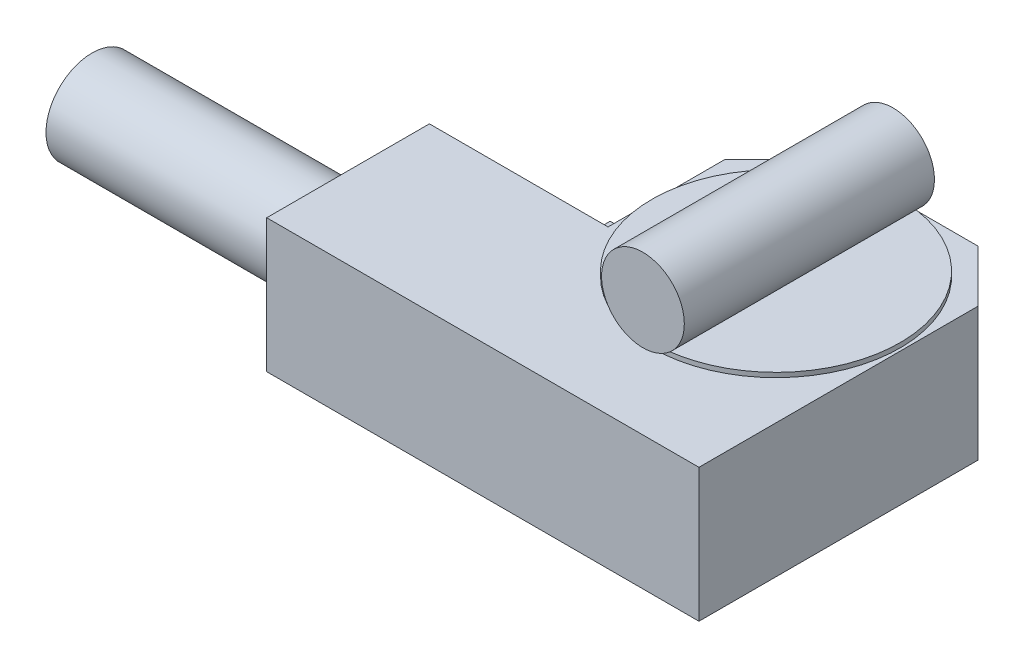
ISO-10303-21;
HEADER;
FILE_DESCRIPTION(('STEP AP214'),'2;1');
FILE_NAME('part.step','',(''),(''),'','','');
FILE_SCHEMA(('AUTOMOTIVE_DESIGN { 1 0 10303 214 1 1 1 1 }'));
ENDSEC;
DATA;
#1=APPLICATION_CONTEXT('core data for automotive mechanical design processes');
#2=APPLICATION_PROTOCOL_DEFINITION('international standard','automotive_design',2000,#1);
#3=PRODUCT_CONTEXT('',#1,'mechanical');
#4=PRODUCT('Part','Part','',(#3));
#5=PRODUCT_RELATED_PRODUCT_CATEGORY('part','',(#4));
#6=PRODUCT_DEFINITION_FORMATION('','',#4);
#7=PRODUCT_DEFINITION_CONTEXT('part definition',#1,'design');
#8=PRODUCT_DEFINITION('design','',#6,#7);
#9=PRODUCT_DEFINITION_SHAPE('','',#8);
#10=(LENGTH_UNIT() NAMED_UNIT(*) SI_UNIT(.MILLI.,.METRE.));
#11=(NAMED_UNIT(*) PLANE_ANGLE_UNIT() SI_UNIT($,.RADIAN.));
#12=(NAMED_UNIT(*) SI_UNIT($,.STERADIAN.) SOLID_ANGLE_UNIT());
#13=UNCERTAINTY_MEASURE_WITH_UNIT(LENGTH_MEASURE(1.E-05),#10,'distance_accuracy_value','');
#14=(GEOMETRIC_REPRESENTATION_CONTEXT(3) GLOBAL_UNCERTAINTY_ASSIGNED_CONTEXT((#13)) GLOBAL_UNIT_ASSIGNED_CONTEXT((#10,
#11,#12)) REPRESENTATION_CONTEXT('',''));
#15=CARTESIAN_POINT('',(0.,0.,0.));
#16=DIRECTION('',(0.,0.,1.));
#17=DIRECTION('',(1.,0.,0.));
#18=AXIS2_PLACEMENT_3D('',#15,#16,#17);
#19=CARTESIAN_POINT('',(33.20461280611,15.,-22.1746505753478));
#20=DIRECTION('',(0.,1.,0.));
#21=DIRECTION('',(0.,0.,1.));
#22=AXIS2_PLACEMENT_3D('',#19,#20,#21);
#23=PLANE('',#22);
#24=CARTESIAN_POINT('',(33.20461280611,15.,-22.1746505753478));
#25=DIRECTION('',(0.,1.,0.));
#26=DIRECTION('',(0.,0.,1.));
#27=AXIS2_PLACEMENT_3D('',#24,#25,#26);
#28=CIRCLE('',#27,13.5);
#29=CARTESIAN_POINT('',(33.20461280611,15.,-8.67465057534783));
#30=VERTEX_POINT('',#29);
#31=EDGE_CURVE('E131',#30,#30,#28,.T.);
#32=ORIENTED_EDGE('',*,*,#31,.T.);
#33=EDGE_LOOP('',(#32));
#34=FACE_BOUND('',#33,.T.);
#35=ADVANCED_FACE('F128',(#34),#23,.T.);
#36=CARTESIAN_POINT('',(19.4121437737425,14.5,-30.3431457505076));
#37=DIRECTION('',(0.,0.,1.));
#38=DIRECTION('',(1.,0.,0.));
#39=AXIS2_PLACEMENT_3D('',#36,#37,#38);
#40=PLANE('',#39);
#41=DIRECTION('',(-1.,0.,0.));
#42=VECTOR('',#41,1.);
#43=CARTESIAN_POINT('',(7.,2.5,-30.3431457505076));
#44=LINE('',#43,#42);
#45=CARTESIAN_POINT('',(19.4121437737425,2.5,-30.3431457505076));
#46=VERTEX_POINT('',#45);
#47=CARTESIAN_POINT('',(7.,2.5,-30.3431457505076));
#48=VERTEX_POINT('',#47);
#49=EDGE_CURVE('E145',#46,#48,#44,.T.);
#50=ORIENTED_EDGE('',*,*,#49,.F.);
#51=DIRECTION('',(0.,-1.,0.));
#52=VECTOR('',#51,1.);
#53=CARTESIAN_POINT('',(19.4121437737425,14.5,-30.3431457505076));
#54=LINE('',#53,#52);
#55=CARTESIAN_POINT('',(19.4121437737425,0.,-30.3431457505076));
#56=VERTEX_POINT('',#55);
#57=EDGE_CURVE('E243',#46,#56,#54,.T.);
#58=ORIENTED_EDGE('',*,*,#57,.T.);
#59=DIRECTION('',(-1.,0.,0.));
#60=VECTOR('',#59,1.);
#61=CARTESIAN_POINT('',(19.4121437737425,0.,-30.3431457505076));
#62=LINE('',#61,#60);
#63=CARTESIAN_POINT('',(7.,0.,-30.3431457505076));
#64=VERTEX_POINT('',#63);
#65=EDGE_CURVE('E309',#56,#64,#62,.T.);
#66=ORIENTED_EDGE('',*,*,#65,.T.);
#67=DIRECTION('',(0.,-1.,0.));
#68=VECTOR('',#67,1.);
#69=CARTESIAN_POINT('',(7.,14.5,-30.3431457505076));
#70=LINE('',#69,#68);
#71=EDGE_CURVE('E306',#48,#64,#70,.T.);
#72=ORIENTED_EDGE('',*,*,#71,.F.);
#73=EDGE_LOOP('',(#50,#58,#66,#72));
#74=FACE_BOUND('',#73,.T.);
#75=ADVANCED_FACE('F370',(#74),#40,.F.);
#76=CARTESIAN_POINT('',(7.,14.5,-30.3431457505076));
#77=DIRECTION('',(1.,0.,0.));
#78=DIRECTION('',(0.,0.,-1.));
#79=AXIS2_PLACEMENT_3D('',#76,#77,#78);
#80=PLANE('',#79);
#81=DIRECTION('',(0.,0.,1.));
#82=VECTOR('',#81,1.);
#83=CARTESIAN_POINT('',(7.,2.5,-30.3431457505076));
#84=LINE('',#83,#82);
#85=CARTESIAN_POINT('',(7.,2.5,-17.6917613636364));
#86=VERTEX_POINT('',#85);
#87=EDGE_CURVE('E252',#48,#86,#84,.T.);
#88=ORIENTED_EDGE('',*,*,#87,.F.);
#89=ORIENTED_EDGE('',*,*,#71,.T.);
#90=DIRECTION('',(0.,0.,1.));
#91=VECTOR('',#90,1.);
#92=CARTESIAN_POINT('',(7.,0.,-30.3431457505076));
#93=LINE('',#92,#91);
#94=CARTESIAN_POINT('',(7.,0.,-17.6917613636364));
#95=VERTEX_POINT('',#94);
#96=EDGE_CURVE('E308',#64,#95,#93,.T.);
#97=ORIENTED_EDGE('',*,*,#96,.T.);
#98=DIRECTION('',(0.,-1.,0.));
#99=VECTOR('',#98,1.);
#100=CARTESIAN_POINT('',(7.,14.5,-17.6917613636364));
#101=LINE('',#100,#99);
#102=EDGE_CURVE('E310',#86,#95,#101,.T.);
#103=ORIENTED_EDGE('',*,*,#102,.F.);
#104=EDGE_LOOP('',(#88,#89,#97,#103));
#105=FACE_BOUND('',#104,.T.);
#106=ADVANCED_FACE('F374',(#105),#80,.F.);
#107=CARTESIAN_POINT('',(0.,14.5,-17.6917613636364));
#108=DIRECTION('',(1.,0.,0.));
#109=DIRECTION('',(0.,0.,-1.));
#110=AXIS2_PLACEMENT_3D('',#107,#108,#109);
#111=PLANE('',#110);
#112=CARTESIAN_POINT('',(0.,7.5149997553865,-8.));
#113=DIRECTION('',(1.,0.,0.));
#114=DIRECTION('',(0.,0.,-1.));
#115=AXIS2_PLACEMENT_3D('',#112,#113,#114);
#116=CIRCLE('',#115,5.);
#117=CARTESIAN_POINT('',(0.,7.5149997553865,-13.));
#118=VERTEX_POINT('',#117);
#119=EDGE_CURVE('E275',#118,#118,#116,.F.);
#120=ORIENTED_EDGE('',*,*,#119,.F.);
#121=EDGE_LOOP('',(#120));
#122=FACE_BOUND('',#121,.T.);
#123=DIRECTION('',(0.,0.,1.));
#124=VECTOR('',#123,1.);
#125=CARTESIAN_POINT('',(0.,0.,-17.6917613636364));
#126=LINE('',#125,#124);
#127=CARTESIAN_POINT('',(0.,0.,-17.6917613636364));
#128=VERTEX_POINT('',#127);
#129=CARTESIAN_POINT('',(0.,0.,0.));
#130=VERTEX_POINT('',#129);
#131=EDGE_CURVE('E314',#128,#130,#126,.T.);
#132=ORIENTED_EDGE('',*,*,#131,.T.);
#133=DIRECTION('',(0.,-1.,0.));
#134=VECTOR('',#133,1.);
#135=CARTESIAN_POINT('',(0.,14.5,0.));
#136=LINE('',#135,#134);
#137=CARTESIAN_POINT('',(0.,14.5,0.));
#138=VERTEX_POINT('',#137);
#139=EDGE_CURVE('E286',#138,#130,#136,.T.);
#140=ORIENTED_EDGE('',*,*,#139,.F.);
#141=DIRECTION('',(0.,0.,1.));
#142=VECTOR('',#141,1.);
#143=CARTESIAN_POINT('',(0.,14.5,-17.6917613636364));
#144=LINE('',#143,#142);
#145=CARTESIAN_POINT('',(0.,14.5,-17.6917613636364));
#146=VERTEX_POINT('',#145);
#147=EDGE_CURVE('E329',#146,#138,#144,.T.);
#148=ORIENTED_EDGE('',*,*,#147,.F.);
#149=DIRECTION('',(0.,-1.,0.));
#150=VECTOR('',#149,1.);
#151=CARTESIAN_POINT('',(0.,14.5,-17.6917613636364));
#152=LINE('',#151,#150);
#153=EDGE_CURVE('E312',#146,#128,#152,.T.);
#154=ORIENTED_EDGE('',*,*,#153,.T.);
#155=EDGE_LOOP('',(#132,#140,#148,#154));
#156=FACE_BOUND('',#155,.T.);
#157=ADVANCED_FACE('F344',(#122,#156),#111,.F.);
#158=CARTESIAN_POINT('',(0.,14.5,0.));
#159=DIRECTION('',(0.,0.,-1.));
#160=DIRECTION('',(-1.,0.,0.));
#161=AXIS2_PLACEMENT_3D('',#158,#159,#160);
#162=PLANE('',#161);
#163=DIRECTION('',(1.,0.,0.));
#164=VECTOR('',#163,1.);
#165=CARTESIAN_POINT('',(0.,0.,0.));
#166=LINE('',#165,#164);
#167=CARTESIAN_POINT('',(47.,0.,0.));
#168=VERTEX_POINT('',#167);
#169=EDGE_CURVE('E290',#130,#168,#166,.T.);
#170=ORIENTED_EDGE('',*,*,#169,.T.);
#171=DIRECTION('',(0.,-1.,0.));
#172=VECTOR('',#171,1.);
#173=CARTESIAN_POINT('',(47.,14.5,0.));
#174=LINE('',#173,#172);
#175=CARTESIAN_POINT('',(47.,14.5,0.));
#176=VERTEX_POINT('',#175);
#177=EDGE_CURVE('E291',#176,#168,#174,.T.);
#178=ORIENTED_EDGE('',*,*,#177,.F.);
#179=DIRECTION('',(1.,0.,0.));
#180=VECTOR('',#179,1.);
#181=CARTESIAN_POINT('',(0.,14.5,0.));
#182=LINE('',#181,#180);
#183=EDGE_CURVE('E337',#138,#176,#182,.T.);
#184=ORIENTED_EDGE('',*,*,#183,.F.);
#185=ORIENTED_EDGE('',*,*,#139,.T.);
#186=EDGE_LOOP('',(#170,#178,#184,#185));
#187=FACE_BOUND('',#186,.T.);
#188=ADVANCED_FACE('F347',(#187),#162,.F.);
#189=CARTESIAN_POINT('',(47.,14.5,0.));
#190=DIRECTION('',(-1.,0.,0.));
#191=DIRECTION('',(0.,0.,1.));
#192=AXIS2_PLACEMENT_3D('',#189,#190,#191);
#193=PLANE('',#192);
#194=DIRECTION('',(0.,0.,-1.));
#195=VECTOR('',#194,1.);
#196=CARTESIAN_POINT('',(47.,0.,0.));
#197=LINE('',#196,#195);
#198=CARTESIAN_POINT('',(47.,0.,-30.3431457505076));
#199=VERTEX_POINT('',#198);
#200=EDGE_CURVE('E289',#168,#199,#197,.T.);
#201=ORIENTED_EDGE('',*,*,#200,.T.);
#202=DIRECTION('',(0.,-1.,0.));
#203=VECTOR('',#202,1.);
#204=CARTESIAN_POINT('',(47.,14.5,-30.3431457505076));
#205=LINE('',#204,#203);
#206=CARTESIAN_POINT('',(47.,14.5,-30.3431457505076));
#207=VERTEX_POINT('',#206);
#208=EDGE_CURVE('E295',#207,#199,#205,.T.);
#209=ORIENTED_EDGE('',*,*,#208,.F.);
#210=DIRECTION('',(0.,0.,-1.));
#211=VECTOR('',#210,1.);
#212=CARTESIAN_POINT('',(47.,14.5,0.));
#213=LINE('',#212,#211);
#214=EDGE_CURVE('E335',#176,#207,#213,.T.);
#215=ORIENTED_EDGE('',*,*,#214,.F.);
#216=ORIENTED_EDGE('',*,*,#177,.T.);
#217=EDGE_LOOP('',(#201,#209,#215,#216));
#218=FACE_BOUND('',#217,.T.);
#219=ADVANCED_FACE('F352',(#218),#193,.F.);
#220=CARTESIAN_POINT('',(47.,14.5,-30.3431457505076));
#221=DIRECTION('',(-0.707106781186546,0.,0.707106781186549));
#222=DIRECTION('',(0.707106781186549,0.,0.707106781186546));
#223=AXIS2_PLACEMENT_3D('',#220,#221,#222);
#224=PLANE('',#223);
#225=DIRECTION('',(-0.707106781186549,0.,-0.707106781186546));
#226=VECTOR('',#225,1.);
#227=CARTESIAN_POINT('',(47.,0.,-30.3431457505076));
#228=LINE('',#227,#226);
#229=CARTESIAN_POINT('',(41.3431457505076,0.,-36.));
#230=VERTEX_POINT('',#229);
#231=EDGE_CURVE('E294',#199,#230,#228,.T.);
#232=ORIENTED_EDGE('',*,*,#231,.T.);
#233=DIRECTION('',(0.,-1.,0.));
#234=VECTOR('',#233,1.);
#235=CARTESIAN_POINT('',(41.3431457505076,14.5,-36.));
#236=LINE('',#235,#234);
#237=CARTESIAN_POINT('',(41.3431457505076,14.5,-36.));
#238=VERTEX_POINT('',#237);
#239=EDGE_CURVE('E299',#238,#230,#236,.T.);
#240=ORIENTED_EDGE('',*,*,#239,.F.);
#241=DIRECTION('',(-0.707106781186549,0.,-0.707106781186546));
#242=VECTOR('',#241,1.);
#243=CARTESIAN_POINT('',(47.,14.5,-30.3431457505076));
#244=LINE('',#243,#242);
#245=EDGE_CURVE('E333',#207,#238,#244,.T.);
#246=ORIENTED_EDGE('',*,*,#245,.F.);
#247=ORIENTED_EDGE('',*,*,#208,.T.);
#248=EDGE_LOOP('',(#232,#240,#246,#247));
#249=FACE_BOUND('',#248,.T.);
#250=ADVANCED_FACE('F358',(#249),#224,.F.);
#251=CARTESIAN_POINT('',(41.3431457505076,14.5,-36.));
#252=DIRECTION('',(0.,0.,1.));
#253=DIRECTION('',(1.,0.,0.));
#254=AXIS2_PLACEMENT_3D('',#251,#252,#253);
#255=PLANE('',#254);
#256=DIRECTION('',(-1.,0.,0.));
#257=VECTOR('',#256,1.);
#258=CARTESIAN_POINT('',(41.3431457505076,0.,-36.));
#259=LINE('',#258,#257);
#260=CARTESIAN_POINT('',(25.0689980232349,0.,-36.));
#261=VERTEX_POINT('',#260);
#262=EDGE_CURVE('E298',#230,#261,#259,.T.);
#263=ORIENTED_EDGE('',*,*,#262,.T.);
#264=DIRECTION('',(0.,-1.,0.));
#265=VECTOR('',#264,1.);
#266=CARTESIAN_POINT('',(25.0689980232349,14.5,-36.));
#267=LINE('',#266,#265);
#268=CARTESIAN_POINT('',(25.0689980232349,14.5,-36.));
#269=VERTEX_POINT('',#268);
#270=EDGE_CURVE('E303',#269,#261,#267,.T.);
#271=ORIENTED_EDGE('',*,*,#270,.F.);
#272=DIRECTION('',(-1.,0.,0.));
#273=VECTOR('',#272,1.);
#274=CARTESIAN_POINT('',(41.3431457505076,14.5,-36.));
#275=LINE('',#274,#273);
#276=EDGE_CURVE('E331',#238,#269,#275,.T.);
#277=ORIENTED_EDGE('',*,*,#276,.F.);
#278=ORIENTED_EDGE('',*,*,#239,.T.);
#279=EDGE_LOOP('',(#263,#271,#277,#278));
#280=FACE_BOUND('',#279,.T.);
#281=ADVANCED_FACE('F362',(#280),#255,.F.);
#282=CARTESIAN_POINT('',(25.0689980232349,14.5,-36.));
#283=DIRECTION('',(0.707106781186548,0.,0.707106781186547));
#284=DIRECTION('',(0.707106781186547,0.,-0.707106781186548));
#285=AXIS2_PLACEMENT_3D('',#282,#283,#284);
#286=PLANE('',#285);
#287=DIRECTION('',(-0.707106781186547,0.,0.707106781186548));
#288=VECTOR('',#287,1.);
#289=CARTESIAN_POINT('',(25.0689980232349,0.,-36.));
#290=LINE('',#289,#288);
#291=EDGE_CURVE('E302',#261,#56,#290,.T.);
#292=ORIENTED_EDGE('',*,*,#291,.T.);
#293=ORIENTED_EDGE('',*,*,#57,.F.);
#294=CARTESIAN_POINT('',(19.4121437737425,14.5,-30.3431457505076));
#295=VERTEX_POINT('',#294);
#296=EDGE_CURVE('E235',#295,#46,#54,.T.);
#297=ORIENTED_EDGE('',*,*,#296,.F.);
#298=DIRECTION('',(-0.707106781186547,0.,0.707106781186548));
#299=VECTOR('',#298,1.);
#300=CARTESIAN_POINT('',(25.0689980232349,14.5,-36.));
#301=LINE('',#300,#299);
#302=EDGE_CURVE('E239',#269,#295,#301,.T.);
#303=ORIENTED_EDGE('',*,*,#302,.F.);
#304=ORIENTED_EDGE('',*,*,#270,.T.);
#305=EDGE_LOOP('',(#292,#293,#297,#303,#304));
#306=FACE_BOUND('',#305,.T.);
#307=ADVANCED_FACE('F365',(#306),#286,.F.);
#308=CARTESIAN_POINT('',(7.,14.5,-17.6917613636364));
#309=DIRECTION('',(0.,0.,1.));
#310=DIRECTION('',(1.,0.,0.));
#311=AXIS2_PLACEMENT_3D('',#308,#309,#310);
#312=PLANE('',#311);
#313=DIRECTION('',(-1.,0.,0.));
#314=VECTOR('',#313,1.);
#315=CARTESIAN_POINT('',(7.,0.,-17.6917613636364));
#316=LINE('',#315,#314);
#317=EDGE_CURVE('E171',#95,#128,#316,.T.);
#318=ORIENTED_EDGE('',*,*,#317,.T.);
#319=ORIENTED_EDGE('',*,*,#153,.F.);
#320=DIRECTION('',(-1.,0.,0.));
#321=VECTOR('',#320,1.);
#322=CARTESIAN_POINT('',(7.,14.5,-17.6917613636364));
#323=LINE('',#322,#321);
#324=CARTESIAN_POINT('',(19.4228453528915,14.5,-17.6917613636364));
#325=VERTEX_POINT('',#324);
#326=EDGE_CURVE('E165',#325,#146,#323,.T.);
#327=ORIENTED_EDGE('',*,*,#326,.F.);
#328=DIRECTION('',(0.,1.,0.));
#329=VECTOR('',#328,1.);
#330=CARTESIAN_POINT('',(19.4228453528915,2.5,-17.6917613636364));
#331=LINE('',#330,#329);
#332=CARTESIAN_POINT('',(19.4228453528915,2.5,-17.6917613636364));
#333=VERTEX_POINT('',#332);
#334=EDGE_CURVE('E159',#333,#325,#331,.T.);
#335=ORIENTED_EDGE('',*,*,#334,.F.);
#336=DIRECTION('',(1.,0.,0.));
#337=VECTOR('',#336,1.);
#338=CARTESIAN_POINT('',(7.,2.5,-17.6917613636364));
#339=LINE('',#338,#337);
#340=EDGE_CURVE('E249',#86,#333,#339,.T.);
#341=ORIENTED_EDGE('',*,*,#340,.F.);
#342=ORIENTED_EDGE('',*,*,#102,.T.);
#343=EDGE_LOOP('',(#318,#319,#327,#335,#341,#342));
#344=FACE_BOUND('',#343,.T.);
#345=ADVANCED_FACE('F376',(#344),#312,.F.);
#346=CARTESIAN_POINT('',(0.,14.5,0.));
#347=DIRECTION('',(0.,1.,0.));
#348=DIRECTION('',(0.,0.,1.));
#349=AXIS2_PLACEMENT_3D('',#346,#347,#348);
#350=PLANE('',#349);
#351=CARTESIAN_POINT('',(33.20461280611,14.5,-22.1746505753478));
#352=DIRECTION('',(0.,1.,0.));
#353=DIRECTION('',(0.,0.,1.));
#354=AXIS2_PLACEMENT_3D('',#351,#352,#353);
#355=CIRCLE('',#354,13.5);
#356=CARTESIAN_POINT('',(33.20461280611,14.5,-8.67465057534783));
#357=VERTEX_POINT('',#356);
#358=EDGE_CURVE('E15',#357,#357,#355,.T.);
#359=ORIENTED_EDGE('',*,*,#358,.F.);
#360=EDGE_LOOP('',(#359));
#361=FACE_BOUND('',#360,.T.);
#362=DIRECTION('',(-1.,0.,0.));
#363=VECTOR('',#362,1.);
#364=CARTESIAN_POINT('',(7.,14.5,-30.3431457505076));
#365=LINE('',#364,#363);
#366=CARTESIAN_POINT('',(19.4228453528915,14.5,-30.3431457505076));
#367=VERTEX_POINT('',#366);
#368=EDGE_CURVE('E224',#367,#295,#365,.T.);
#369=ORIENTED_EDGE('',*,*,#368,.F.);
#370=DIRECTION('',(0.,0.,-1.));
#371=VECTOR('',#370,1.);
#372=CARTESIAN_POINT('',(19.4228453528915,14.5,-30.3431457505076));
#373=LINE('',#372,#371);
#374=EDGE_CURVE('E232',#325,#367,#373,.T.);
#375=ORIENTED_EDGE('',*,*,#374,.F.);
#376=ORIENTED_EDGE('',*,*,#326,.T.);
#377=ORIENTED_EDGE('',*,*,#147,.T.);
#378=ORIENTED_EDGE('',*,*,#183,.T.);
#379=ORIENTED_EDGE('',*,*,#214,.T.);
#380=ORIENTED_EDGE('',*,*,#245,.T.);
#381=ORIENTED_EDGE('',*,*,#276,.T.);
#382=ORIENTED_EDGE('',*,*,#302,.T.);
#383=EDGE_LOOP('',(#369,#375,#376,#377,#378,#379,#380,#381,#382));
#384=FACE_BOUND('',#383,.T.);
#385=ADVANCED_FACE('F237',(#361,#384),#350,.T.);
#386=CARTESIAN_POINT('',(0.,0.,0.));
#387=DIRECTION('',(0.,1.,0.));
#388=DIRECTION('',(0.,0.,1.));
#389=AXIS2_PLACEMENT_3D('',#386,#387,#388);
#390=PLANE('',#389);
#391=CARTESIAN_POINT('',(16.1493411910487,0.,-27.017453557072));
#392=DIRECTION('',(0.,1.,0.));
#393=DIRECTION('',(0.,0.,1.));
#394=AXIS2_PLACEMENT_3D('',#391,#392,#393);
#395=CIRCLE('',#394,1.1);
#396=CARTESIAN_POINT('',(16.1493411910487,0.,-25.917453557072));
#397=VERTEX_POINT('',#396);
#398=EDGE_CURVE('E272',#397,#397,#395,.T.);
#399=ORIENTED_EDGE('',*,*,#398,.T.);
#400=EDGE_LOOP('',(#399));
#401=FACE_BOUND('',#400,.T.);
#402=CARTESIAN_POINT('',(10.2114226764458,0.,-20.9650833174458));
#403=DIRECTION('',(0.,1.,0.));
#404=DIRECTION('',(0.,0.,1.));
#405=AXIS2_PLACEMENT_3D('',#402,#403,#404);
#406=CIRCLE('',#405,1.1);
#407=CARTESIAN_POINT('',(10.2114226764458,0.,-19.8650833174458));
#408=VERTEX_POINT('',#407);
#409=EDGE_CURVE('E266',#408,#408,#406,.T.);
#410=ORIENTED_EDGE('',*,*,#409,.T.);
#411=EDGE_LOOP('',(#410));
#412=FACE_BOUND('',#411,.T.);
#413=CARTESIAN_POINT('',(16.1493411910487,0.,-21.0254871138211));
#414=DIRECTION('',(0.,1.,0.));
#415=DIRECTION('',(0.,0.,1.));
#416=AXIS2_PLACEMENT_3D('',#413,#414,#415);
#417=CIRCLE('',#416,1.1);
#418=CARTESIAN_POINT('',(16.1493411910487,0.,-19.9254871138211));
#419=VERTEX_POINT('',#418);
#420=EDGE_CURVE('E260',#419,#419,#417,.T.);
#421=ORIENTED_EDGE('',*,*,#420,.T.);
#422=EDGE_LOOP('',(#421));
#423=FACE_BOUND('',#422,.T.);
#424=CARTESIAN_POINT('',(10.2114226764458,0.,-27.017453557072));
#425=DIRECTION('',(0.,1.,0.));
#426=DIRECTION('',(0.,0.,1.));
#427=AXIS2_PLACEMENT_3D('',#424,#425,#426);
#428=CIRCLE('',#427,1.1);
#429=CARTESIAN_POINT('',(10.2114226764458,0.,-25.917453557072));
#430=VERTEX_POINT('',#429);
#431=EDGE_CURVE('E229',#430,#430,#428,.T.);
#432=ORIENTED_EDGE('',*,*,#431,.T.);
#433=EDGE_LOOP('',(#432));
#434=FACE_BOUND('',#433,.T.);
#435=ORIENTED_EDGE('',*,*,#131,.F.);
#436=ORIENTED_EDGE('',*,*,#317,.F.);
#437=ORIENTED_EDGE('',*,*,#96,.F.);
#438=ORIENTED_EDGE('',*,*,#65,.F.);
#439=ORIENTED_EDGE('',*,*,#291,.F.);
#440=ORIENTED_EDGE('',*,*,#262,.F.);
#441=ORIENTED_EDGE('',*,*,#231,.F.);
#442=ORIENTED_EDGE('',*,*,#200,.F.);
#443=ORIENTED_EDGE('',*,*,#169,.F.);
#444=EDGE_LOOP('',(#435,#436,#437,#438,#439,#440,#441,#442,#443));
#445=FACE_BOUND('',#444,.T.);
#446=ADVANCED_FACE('F383',(#401,#412,#423,#434,#445),#390,.F.);
#447=CARTESIAN_POINT('',(7.,2.5,-30.3431457505076));
#448=DIRECTION('',(0.,0.,-1.));
#449=DIRECTION('',(-1.,0.,0.));
#450=AXIS2_PLACEMENT_3D('',#447,#448,#449);
#451=PLANE('',#450);
#452=CARTESIAN_POINT('',(19.4228453528915,2.5,-30.3431457505076));
#453=VERTEX_POINT('',#452);
#454=EDGE_CURVE('E226',#453,#46,#44,.T.);
#455=ORIENTED_EDGE('',*,*,#454,.F.);
#456=DIRECTION('',(0.,1.,0.));
#457=VECTOR('',#456,1.);
#458=CARTESIAN_POINT('',(19.4228453528915,2.5,-30.3431457505076));
#459=LINE('',#458,#457);
#460=EDGE_CURVE('E220',#453,#367,#459,.T.);
#461=ORIENTED_EDGE('',*,*,#460,.T.);
#462=ORIENTED_EDGE('',*,*,#368,.T.);
#463=ORIENTED_EDGE('',*,*,#296,.T.);
#464=EDGE_LOOP('',(#455,#461,#462,#463));
#465=FACE_BOUND('',#464,.T.);
#466=ADVANCED_FACE('F222',(#465),#451,.F.);
#467=CARTESIAN_POINT('',(19.4228453528915,2.5,-30.3431457505076));
#468=DIRECTION('',(1.,0.,0.));
#469=DIRECTION('',(0.,0.,-1.));
#470=AXIS2_PLACEMENT_3D('',#467,#468,#469);
#471=PLANE('',#470);
#472=ORIENTED_EDGE('',*,*,#374,.T.);
#473=ORIENTED_EDGE('',*,*,#460,.F.);
#474=DIRECTION('',(0.,0.,-1.));
#475=VECTOR('',#474,1.);
#476=CARTESIAN_POINT('',(19.4228453528915,2.5,-30.3431457505076));
#477=LINE('',#476,#475);
#478=EDGE_CURVE('E247',#333,#453,#477,.T.);
#479=ORIENTED_EDGE('',*,*,#478,.F.);
#480=ORIENTED_EDGE('',*,*,#334,.T.);
#481=EDGE_LOOP('',(#472,#473,#479,#480));
#482=FACE_BOUND('',#481,.T.);
#483=ADVANCED_FACE('F233',(#482),#471,.F.);
#484=CARTESIAN_POINT('',(0.,2.5,0.));
#485=DIRECTION('',(0.,1.,0.));
#486=DIRECTION('',(0.,0.,1.));
#487=AXIS2_PLACEMENT_3D('',#484,#485,#486);
#488=PLANE('',#487);
#489=CARTESIAN_POINT('',(16.1493411910487,2.5,-27.017453557072));
#490=DIRECTION('',(0.,1.,0.));
#491=DIRECTION('',(0.,0.,1.));
#492=AXIS2_PLACEMENT_3D('',#489,#490,#491);
#493=CIRCLE('',#492,1.1);
#494=CARTESIAN_POINT('',(16.1493411910487,2.5,-25.917453557072));
#495=VERTEX_POINT('',#494);
#496=EDGE_CURVE('E269',#495,#495,#493,.T.);
#497=ORIENTED_EDGE('',*,*,#496,.F.);
#498=EDGE_LOOP('',(#497));
#499=FACE_BOUND('',#498,.T.);
#500=CARTESIAN_POINT('',(10.2114226764458,2.5,-20.9650833174458));
#501=DIRECTION('',(0.,1.,0.));
#502=DIRECTION('',(0.,0.,1.));
#503=AXIS2_PLACEMENT_3D('',#500,#501,#502);
#504=CIRCLE('',#503,1.1);
#505=CARTESIAN_POINT('',(10.2114226764458,2.5,-19.8650833174458));
#506=VERTEX_POINT('',#505);
#507=EDGE_CURVE('E263',#506,#506,#504,.T.);
#508=ORIENTED_EDGE('',*,*,#507,.F.);
#509=EDGE_LOOP('',(#508));
#510=FACE_BOUND('',#509,.T.);
#511=CARTESIAN_POINT('',(16.1493411910487,2.5,-21.0254871138211));
#512=DIRECTION('',(0.,1.,0.));
#513=DIRECTION('',(0.,0.,1.));
#514=AXIS2_PLACEMENT_3D('',#511,#512,#513);
#515=CIRCLE('',#514,1.1);
#516=CARTESIAN_POINT('',(16.1493411910487,2.5,-19.9254871138211));
#517=VERTEX_POINT('',#516);
#518=EDGE_CURVE('E257',#517,#517,#515,.T.);
#519=ORIENTED_EDGE('',*,*,#518,.F.);
#520=EDGE_LOOP('',(#519));
#521=FACE_BOUND('',#520,.T.);
#522=CARTESIAN_POINT('',(10.2114226764458,2.5,-27.017453557072));
#523=DIRECTION('',(0.,1.,0.));
#524=DIRECTION('',(0.,0.,1.));
#525=AXIS2_PLACEMENT_3D('',#522,#523,#524);
#526=CIRCLE('',#525,1.1);
#527=CARTESIAN_POINT('',(10.2114226764458,2.5,-25.917453557072));
#528=VERTEX_POINT('',#527);
#529=EDGE_CURVE('E254',#528,#528,#526,.T.);
#530=ORIENTED_EDGE('',*,*,#529,.F.);
#531=EDGE_LOOP('',(#530));
#532=FACE_BOUND('',#531,.T.);
#533=ORIENTED_EDGE('',*,*,#87,.T.);
#534=ORIENTED_EDGE('',*,*,#340,.T.);
#535=ORIENTED_EDGE('',*,*,#478,.T.);
#536=ORIENTED_EDGE('',*,*,#454,.T.);
#537=ORIENTED_EDGE('',*,*,#49,.T.);
#538=EDGE_LOOP('',(#533,#534,#535,#536,#537));
#539=FACE_BOUND('',#538,.T.);
#540=ADVANCED_FACE('F367',(#499,#510,#521,#532,#539),#488,.T.);
#541=CARTESIAN_POINT('',(10.2114226764458,0.,-27.017453557072));
#542=DIRECTION('',(0.,1.,0.));
#543=DIRECTION('',(0.,0.,1.));
#544=AXIS2_PLACEMENT_3D('',#541,#542,#543);
#545=CYLINDRICAL_SURFACE('',#544,1.1);
#546=ORIENTED_EDGE('',*,*,#431,.F.);
#547=EDGE_LOOP('',(#546));
#548=FACE_BOUND('',#547,.T.);
#549=ORIENTED_EDGE('',*,*,#529,.T.);
#550=EDGE_LOOP('',(#549));
#551=FACE_BOUND('',#550,.T.);
#552=ADVANCED_FACE('F423',(#548,#551),#545,.F.);
#553=CARTESIAN_POINT('',(16.1493411910487,0.,-21.0254871138211));
#554=DIRECTION('',(0.,1.,0.));
#555=DIRECTION('',(0.,0.,1.));
#556=AXIS2_PLACEMENT_3D('',#553,#554,#555);
#557=CYLINDRICAL_SURFACE('',#556,1.1);
#558=ORIENTED_EDGE('',*,*,#420,.F.);
#559=EDGE_LOOP('',(#558));
#560=FACE_BOUND('',#559,.T.);
#561=ORIENTED_EDGE('',*,*,#518,.T.);
#562=EDGE_LOOP('',(#561));
#563=FACE_BOUND('',#562,.T.);
#564=ADVANCED_FACE('F419',(#560,#563),#557,.F.);
#565=CARTESIAN_POINT('',(10.2114226764458,0.,-20.9650833174458));
#566=DIRECTION('',(0.,1.,0.));
#567=DIRECTION('',(0.,0.,1.));
#568=AXIS2_PLACEMENT_3D('',#565,#566,#567);
#569=CYLINDRICAL_SURFACE('',#568,1.1);
#570=ORIENTED_EDGE('',*,*,#409,.F.);
#571=EDGE_LOOP('',(#570));
#572=FACE_BOUND('',#571,.T.);
#573=ORIENTED_EDGE('',*,*,#507,.T.);
#574=EDGE_LOOP('',(#573));
#575=FACE_BOUND('',#574,.T.);
#576=ADVANCED_FACE('F415',(#572,#575),#569,.F.);
#577=CARTESIAN_POINT('',(16.1493411910487,0.,-27.017453557072));
#578=DIRECTION('',(0.,1.,0.));
#579=DIRECTION('',(0.,0.,1.));
#580=AXIS2_PLACEMENT_3D('',#577,#578,#579);
#581=CYLINDRICAL_SURFACE('',#580,1.1);
#582=ORIENTED_EDGE('',*,*,#398,.F.);
#583=EDGE_LOOP('',(#582));
#584=FACE_BOUND('',#583,.T.);
#585=ORIENTED_EDGE('',*,*,#496,.T.);
#586=EDGE_LOOP('',(#585));
#587=FACE_BOUND('',#586,.T.);
#588=ADVANCED_FACE('F411',(#584,#587),#581,.F.);
#589=CARTESIAN_POINT('',(-27.,7.5149997553865,-8.));
#590=DIRECTION('',(1.,0.,0.));
#591=DIRECTION('',(0.,0.,-1.));
#592=AXIS2_PLACEMENT_3D('',#589,#590,#591);
#593=CYLINDRICAL_SURFACE('',#592,5.);
#594=CARTESIAN_POINT('',(-27.,7.5149997553865,-8.));
#595=DIRECTION('',(-1.,0.,0.));
#596=DIRECTION('',(0.,0.,1.));
#597=AXIS2_PLACEMENT_3D('',#594,#595,#596);
#598=CIRCLE('',#597,5.);
#599=CARTESIAN_POINT('',(-27.,7.5149997553865,-3.));
#600=VERTEX_POINT('',#599);
#601=EDGE_CURVE('E137',#600,#600,#598,.T.);
#602=ORIENTED_EDGE('',*,*,#601,.F.);
#603=EDGE_LOOP('',(#602));
#604=FACE_BOUND('',#603,.T.);
#605=ORIENTED_EDGE('',*,*,#119,.T.);
#606=EDGE_LOOP('',(#605));
#607=FACE_BOUND('',#606,.T.);
#608=ADVANCED_FACE('F406',(#604,#607),#593,.T.);
#609=CARTESIAN_POINT('',(-27.,7.5149997553865,-8.));
#610=DIRECTION('',(-1.,0.,0.));
#611=DIRECTION('',(0.,0.,1.));
#612=AXIS2_PLACEMENT_3D('',#609,#610,#611);
#613=PLANE('',#612);
#614=ORIENTED_EDGE('',*,*,#601,.T.);
#615=EDGE_LOOP('',(#614));
#616=FACE_BOUND('',#615,.T.);
#617=ADVANCED_FACE('F401',(#616),#613,.T.);
#618=CARTESIAN_POINT('',(33.20461280611,15.,-22.1746505753478));
#619=DIRECTION('',(0.,-1.,0.));
#620=DIRECTION('',(0.,0.,-1.));
#621=AXIS2_PLACEMENT_3D('',#618,#619,#620);
#622=CYLINDRICAL_SURFACE('',#621,13.5);
#623=ORIENTED_EDGE('',*,*,#31,.F.);
#624=EDGE_LOOP('',(#623));
#625=FACE_BOUND('',#624,.T.);
#626=ORIENTED_EDGE('',*,*,#358,.T.);
#627=EDGE_LOOP('',(#626));
#628=FACE_BOUND('',#627,.T.);
#629=ADVANCED_FACE('F398',(#625,#628),#622,.T.);
#630=CLOSED_SHELL('',(#35,#75,#106,#157,#188,#219,#250,#281,#307,#345,#385,#446,#466,#483,#540,
#552,#564,#576,#588,#608,#617,#629));
#631=MANIFOLD_SOLID_BREP('B2',#630);
#632=CARTESIAN_POINT('',(33.20461280611,19.5,-36.));
#633=DIRECTION('',(0.,0.,1.));
#634=DIRECTION('',(1.,0.,0.));
#635=AXIS2_PLACEMENT_3D('',#632,#633,#634);
#636=CYLINDRICAL_SURFACE('',#635,4.5);
#637=CARTESIAN_POINT('',(33.20461280611,19.5,-7.70440802457442));
#638=DIRECTION('',(0.,0.,1.));
#639=DIRECTION('',(1.,0.,0.));
#640=AXIS2_PLACEMENT_3D('',#637,#638,#639);
#641=CIRCLE('',#640,4.5);
#642=CARTESIAN_POINT('',(37.70461280611,19.5,-7.70440802457442));
#643=VERTEX_POINT('',#642);
#644=EDGE_CURVE('E623',#643,#643,#641,.T.);
#645=ORIENTED_EDGE('',*,*,#644,.F.);
#646=EDGE_LOOP('',(#645));
#647=FACE_BOUND('',#646,.T.);
#648=CARTESIAN_POINT('',(33.20461280611,19.5,-34.9025726367057));
#649=DIRECTION('',(0.,0.,1.));
#650=DIRECTION('',(1.,0.,0.));
#651=AXIS2_PLACEMENT_3D('',#648,#649,#650);
#652=CIRCLE('',#651,4.5);
#653=CARTESIAN_POINT('',(37.70461280611,19.5,-34.9025726367057));
#654=VERTEX_POINT('',#653);
#655=EDGE_CURVE('E127',#654,#654,#652,.T.);
#656=ORIENTED_EDGE('',*,*,#655,.T.);
#657=EDGE_LOOP('',(#656));
#658=FACE_BOUND('',#657,.T.);
#659=ADVANCED_FACE('F616',(#647,#658),#636,.T.);
#660=CARTESIAN_POINT('',(28.70461280611,24.,-34.9025726367057));
#661=DIRECTION('',(0.,0.,1.));
#662=DIRECTION('',(1.,0.,0.));
#663=AXIS2_PLACEMENT_3D('',#660,#661,#662);
#664=PLANE('',#663);
#665=ORIENTED_EDGE('',*,*,#655,.F.);
#666=EDGE_LOOP('',(#665));
#667=FACE_BOUND('',#666,.T.);
#668=ADVANCED_FACE('F631',(#667),#664,.F.);
#669=CARTESIAN_POINT('',(28.70461280611,24.,-7.70440802457442));
#670=DIRECTION('',(0.,0.,-1.));
#671=DIRECTION('',(-1.,0.,0.));
#672=AXIS2_PLACEMENT_3D('',#669,#670,#671);
#673=PLANE('',#672);
#674=ORIENTED_EDGE('',*,*,#644,.T.);
#675=EDGE_LOOP('',(#674));
#676=FACE_BOUND('',#675,.T.);
#677=ADVANCED_FACE('F618',(#676),#673,.F.);
#678=CLOSED_SHELL('',(#659,#668,#677));
#679=MANIFOLD_SOLID_BREP('B9',#678);
#680=ADVANCED_BREP_SHAPE_REPRESENTATION('',(#18,#631,#679),#14);
#681=SHAPE_DEFINITION_REPRESENTATION(#9,#680);
ENDSEC;
END-ISO-10303-21;
